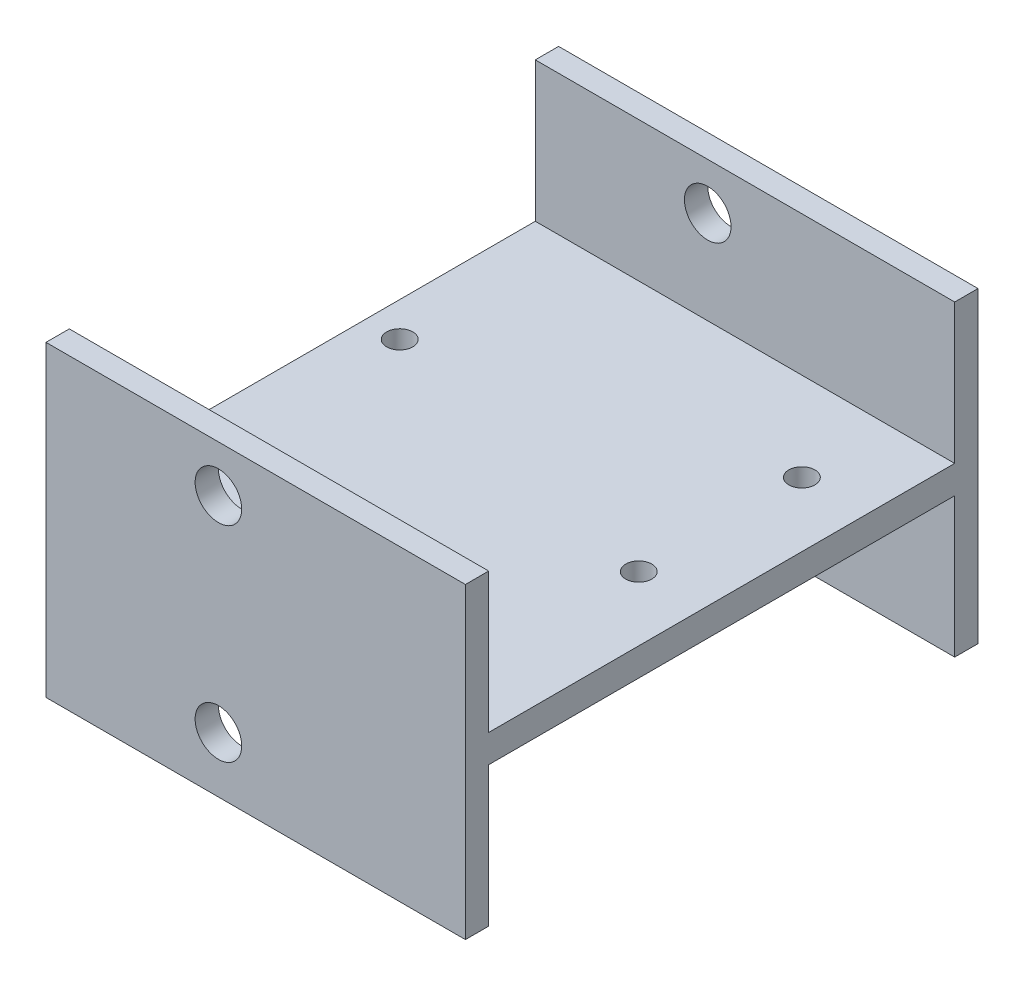
ISO-10303-21;
HEADER;
FILE_DESCRIPTION(('STEP AP214'),'2;1');
FILE_NAME('part.step','',(''),(''),'','','');
FILE_SCHEMA(('AUTOMOTIVE_DESIGN { 1 0 10303 214 1 1 1 1 }'));
ENDSEC;
DATA;
#1=APPLICATION_CONTEXT('core data for automotive mechanical design processes');
#2=APPLICATION_PROTOCOL_DEFINITION('international standard','automotive_design',2000,#1);
#3=PRODUCT_CONTEXT('',#1,'mechanical');
#4=PRODUCT('Part','Part','',(#3));
#5=PRODUCT_RELATED_PRODUCT_CATEGORY('part','',(#4));
#6=PRODUCT_DEFINITION_FORMATION('','',#4);
#7=PRODUCT_DEFINITION_CONTEXT('part definition',#1,'design');
#8=PRODUCT_DEFINITION('design','',#6,#7);
#9=PRODUCT_DEFINITION_SHAPE('','',#8);
#10=(LENGTH_UNIT() NAMED_UNIT(*) SI_UNIT(.MILLI.,.METRE.));
#11=(NAMED_UNIT(*) PLANE_ANGLE_UNIT() SI_UNIT($,.RADIAN.));
#12=(NAMED_UNIT(*) SI_UNIT($,.STERADIAN.) SOLID_ANGLE_UNIT());
#13=UNCERTAINTY_MEASURE_WITH_UNIT(LENGTH_MEASURE(1.E-05),#10,'distance_accuracy_value','');
#14=(GEOMETRIC_REPRESENTATION_CONTEXT(3) GLOBAL_UNCERTAINTY_ASSIGNED_CONTEXT((#13)) GLOBAL_UNIT_ASSIGNED_CONTEXT((#10,
#11,#12)) REPRESENTATION_CONTEXT('',''));
#15=CARTESIAN_POINT('',(0.,0.,0.));
#16=DIRECTION('',(0.,0.,1.));
#17=DIRECTION('',(1.,0.,0.));
#18=AXIS2_PLACEMENT_3D('',#15,#16,#17);
#19=CARTESIAN_POINT('',(-3.07377049180328,3.72540983606557,55.));
#20=DIRECTION('',(0.,-1.,0.));
#21=DIRECTION('',(0.,0.,-1.));
#22=AXIS2_PLACEMENT_3D('',#19,#20,#21);
#23=PLANE('',#22);
#24=CARTESIAN_POINT('',(0.626229508196735,3.72540983606558,20.75));
#25=DIRECTION('',(0.,-1.,0.));
#26=DIRECTION('',(0.,0.,-1.));
#27=AXIS2_PLACEMENT_3D('',#24,#25,#26);
#28=CIRCLE('',#27,1.4);
#29=CARTESIAN_POINT('',(0.626229508196735,3.72540983606558,19.35));
#30=VERTEX_POINT('',#29);
#31=EDGE_CURVE('E239',#30,#30,#28,.T.);
#32=ORIENTED_EDGE('',*,*,#31,.T.);
#33=EDGE_LOOP('',(#32));
#34=FACE_BOUND('',#33,.T.);
#35=CARTESIAN_POINT('',(35.0262295081967,3.72540983606558,12.));
#36=DIRECTION('',(0.,-1.,0.));
#37=DIRECTION('',(0.,0.,-1.));
#38=AXIS2_PLACEMENT_3D('',#35,#36,#37);
#39=CIRCLE('',#38,1.4);
#40=CARTESIAN_POINT('',(35.0262295081967,3.72540983606558,10.6));
#41=VERTEX_POINT('',#40);
#42=EDGE_CURVE('E247',#41,#41,#39,.T.);
#43=ORIENTED_EDGE('',*,*,#42,.T.);
#44=EDGE_LOOP('',(#43));
#45=FACE_BOUND('',#44,.T.);
#46=CARTESIAN_POINT('',(35.0262295081967,3.72540983606558,29.5));
#47=DIRECTION('',(0.,-1.,0.));
#48=DIRECTION('',(0.,0.,-1.));
#49=AXIS2_PLACEMENT_3D('',#46,#47,#48);
#50=CIRCLE('',#49,1.4);
#51=CARTESIAN_POINT('',(35.0262295081967,3.72540983606558,28.1));
#52=VERTEX_POINT('',#51);
#53=EDGE_CURVE('E229',#52,#52,#50,.T.);
#54=ORIENTED_EDGE('',*,*,#53,.T.);
#55=EDGE_LOOP('',(#54));
#56=FACE_BOUND('',#55,.T.);
#57=DIRECTION('',(1.,0.,0.));
#58=VECTOR('',#57,1.);
#59=CARTESIAN_POINT('',(41.9262295081967,3.72540983606557,2.5));
#60=LINE('',#59,#58);
#61=CARTESIAN_POINT('',(-3.07377049180328,3.72540983606557,2.5));
#62=VERTEX_POINT('',#61);
#63=CARTESIAN_POINT('',(41.9262295081967,3.72540983606557,2.5));
#64=VERTEX_POINT('',#63);
#65=EDGE_CURVE('E49',#62,#64,#60,.T.);
#66=ORIENTED_EDGE('',*,*,#65,.F.);
#67=DIRECTION('',(0.,0.,-1.));
#68=VECTOR('',#67,1.);
#69=CARTESIAN_POINT('',(-3.07377049180328,3.72540983606557,55.));
#70=LINE('',#69,#68);
#71=CARTESIAN_POINT('',(-3.07377049180328,3.72540983606557,52.5));
#72=VERTEX_POINT('',#71);
#73=EDGE_CURVE('E238',#72,#62,#70,.T.);
#74=ORIENTED_EDGE('',*,*,#73,.F.);
#75=DIRECTION('',(-1.,0.,0.));
#76=VECTOR('',#75,1.);
#77=CARTESIAN_POINT('',(41.9262295081967,3.72540983606557,52.5));
#78=LINE('',#77,#76);
#79=CARTESIAN_POINT('',(41.9262295081967,3.72540983606557,52.5));
#80=VERTEX_POINT('',#79);
#81=EDGE_CURVE('E158',#80,#72,#78,.T.);
#82=ORIENTED_EDGE('',*,*,#81,.F.);
#83=DIRECTION('',(0.,0.,-1.));
#84=VECTOR('',#83,1.);
#85=CARTESIAN_POINT('',(41.9262295081967,3.72540983606557,55.));
#86=LINE('',#85,#84);
#87=EDGE_CURVE('E54',#80,#64,#86,.T.);
#88=ORIENTED_EDGE('',*,*,#87,.T.);
#89=EDGE_LOOP('',(#66,#74,#82,#88));
#90=FACE_BOUND('',#89,.T.);
#91=ADVANCED_FACE('F32',(#34,#45,#56,#90),#23,.F.);
#92=CARTESIAN_POINT('',(-3.07377049180328,0.725409836065575,55.));
#93=DIRECTION('',(0.,1.,0.));
#94=DIRECTION('',(-1.,0.,0.));
#95=AXIS2_PLACEMENT_3D('',#92,#93,#94);
#96=PLANE('',#95);
#97=CARTESIAN_POINT('',(0.626229508196735,0.725409836065575,20.75));
#98=DIRECTION('',(0.,-1.,0.));
#99=DIRECTION('',(1.,0.,0.));
#100=AXIS2_PLACEMENT_3D('',#97,#98,#99);
#101=CIRCLE('',#100,1.4);
#102=CARTESIAN_POINT('',(2.02622950819673,0.725409836065575,20.75));
#103=VERTEX_POINT('',#102);
#104=EDGE_CURVE('E226',#103,#103,#101,.T.);
#105=ORIENTED_EDGE('',*,*,#104,.F.);
#106=EDGE_LOOP('',(#105));
#107=FACE_BOUND('',#106,.T.);
#108=CARTESIAN_POINT('',(35.0262295081967,0.725409836065575,12.));
#109=DIRECTION('',(0.,-1.,0.));
#110=DIRECTION('',(1.,0.,0.));
#111=AXIS2_PLACEMENT_3D('',#108,#109,#110);
#112=CIRCLE('',#111,1.4);
#113=CARTESIAN_POINT('',(36.4262295081967,0.725409836065575,12.));
#114=VERTEX_POINT('',#113);
#115=EDGE_CURVE('E230',#114,#114,#112,.T.);
#116=ORIENTED_EDGE('',*,*,#115,.F.);
#117=EDGE_LOOP('',(#116));
#118=FACE_BOUND('',#117,.T.);
#119=CARTESIAN_POINT('',(35.0262295081967,0.725409836065575,29.5));
#120=DIRECTION('',(0.,-1.,0.));
#121=DIRECTION('',(1.,0.,0.));
#122=AXIS2_PLACEMENT_3D('',#119,#120,#121);
#123=CIRCLE('',#122,1.4);
#124=CARTESIAN_POINT('',(36.4262295081967,0.725409836065575,29.5));
#125=VERTEX_POINT('',#124);
#126=EDGE_CURVE('E225',#125,#125,#123,.T.);
#127=ORIENTED_EDGE('',*,*,#126,.F.);
#128=EDGE_LOOP('',(#127));
#129=FACE_BOUND('',#128,.T.);
#130=DIRECTION('',(-1.,0.,0.));
#131=VECTOR('',#130,1.);
#132=CARTESIAN_POINT('',(-3.07377049180328,0.725409836065575,2.5));
#133=LINE('',#132,#131);
#134=CARTESIAN_POINT('',(41.9262295081967,0.725409836065575,2.5));
#135=VERTEX_POINT('',#134);
#136=CARTESIAN_POINT('',(-3.07377049180328,0.725409836065575,2.5));
#137=VERTEX_POINT('',#136);
#138=EDGE_CURVE('E188',#135,#137,#133,.T.);
#139=ORIENTED_EDGE('',*,*,#138,.F.);
#140=DIRECTION('',(0.,0.,-1.));
#141=VECTOR('',#140,1.);
#142=CARTESIAN_POINT('',(41.9262295081967,0.725409836065575,55.));
#143=LINE('',#142,#141);
#144=CARTESIAN_POINT('',(41.9262295081967,0.725409836065575,52.5));
#145=VERTEX_POINT('',#144);
#146=EDGE_CURVE('E41',#145,#135,#143,.T.);
#147=ORIENTED_EDGE('',*,*,#146,.F.);
#148=DIRECTION('',(1.,0.,0.));
#149=VECTOR('',#148,1.);
#150=CARTESIAN_POINT('',(-3.07377049180328,0.725409836065575,52.5));
#151=LINE('',#150,#149);
#152=CARTESIAN_POINT('',(-3.07377049180328,0.725409836065575,52.5));
#153=VERTEX_POINT('',#152);
#154=EDGE_CURVE('E205',#153,#145,#151,.T.);
#155=ORIENTED_EDGE('',*,*,#154,.F.);
#156=DIRECTION('',(0.,0.,-1.));
#157=VECTOR('',#156,1.);
#158=CARTESIAN_POINT('',(-3.07377049180328,0.725409836065575,55.));
#159=LINE('',#158,#157);
#160=EDGE_CURVE('E11',#153,#137,#159,.T.);
#161=ORIENTED_EDGE('',*,*,#160,.T.);
#162=EDGE_LOOP('',(#139,#147,#155,#161));
#163=FACE_BOUND('',#162,.T.);
#164=ADVANCED_FACE('F282',(#107,#118,#129,#163),#96,.F.);
#165=CARTESIAN_POINT('',(-3.07377049180328,3.72540983606557,55.));
#166=DIRECTION('',(1.,0.,0.));
#167=DIRECTION('',(0.,0.,-1.));
#168=AXIS2_PLACEMENT_3D('',#165,#166,#167);
#169=PLANE('',#168);
#170=DIRECTION('',(0.,-1.,0.));
#171=VECTOR('',#170,1.);
#172=CARTESIAN_POINT('',(-3.07377049180328,3.72540983606557,0.));
#173=LINE('',#172,#171);
#174=CARTESIAN_POINT('',(-3.07377049180328,18.7254098360656,0.));
#175=VERTEX_POINT('',#174);
#176=CARTESIAN_POINT('',(-3.07377049180328,-14.2745901639344,0.));
#177=VERTEX_POINT('',#176);
#178=EDGE_CURVE('E132',#175,#177,#173,.T.);
#179=ORIENTED_EDGE('',*,*,#178,.T.);
#180=DIRECTION('',(0.,0.,-1.));
#181=VECTOR('',#180,1.);
#182=CARTESIAN_POINT('',(-3.07377049180328,-14.2745901639344,0.));
#183=LINE('',#182,#181);
#184=CARTESIAN_POINT('',(-3.07377049180328,-14.2745901639344,2.5));
#185=VERTEX_POINT('',#184);
#186=EDGE_CURVE('E189',#185,#177,#183,.T.);
#187=ORIENTED_EDGE('',*,*,#186,.F.);
#188=DIRECTION('',(0.,1.,0.));
#189=VECTOR('',#188,1.);
#190=CARTESIAN_POINT('',(-3.07377049180328,-14.2745901639344,2.5));
#191=LINE('',#190,#189);
#192=EDGE_CURVE('E197',#185,#137,#191,.T.);
#193=ORIENTED_EDGE('',*,*,#192,.T.);
#194=ORIENTED_EDGE('',*,*,#160,.F.);
#195=DIRECTION('',(0.,1.,0.));
#196=VECTOR('',#195,1.);
#197=CARTESIAN_POINT('',(-3.07377049180328,-14.2745901639344,52.5));
#198=LINE('',#197,#196);
#199=CARTESIAN_POINT('',(-3.07377049180328,-14.2745901639344,52.5));
#200=VERTEX_POINT('',#199);
#201=EDGE_CURVE('E222',#200,#153,#198,.T.);
#202=ORIENTED_EDGE('',*,*,#201,.F.);
#203=DIRECTION('',(0.,0.,-1.));
#204=VECTOR('',#203,1.);
#205=CARTESIAN_POINT('',(-3.07377049180328,-14.2745901639344,55.));
#206=LINE('',#205,#204);
#207=CARTESIAN_POINT('',(-3.07377049180328,-14.2745901639344,55.));
#208=VERTEX_POINT('',#207);
#209=EDGE_CURVE('E206',#208,#200,#206,.T.);
#210=ORIENTED_EDGE('',*,*,#209,.F.);
#211=DIRECTION('',(0.,-1.,0.));
#212=VECTOR('',#211,1.);
#213=CARTESIAN_POINT('',(-3.07377049180328,3.72540983606557,55.));
#214=LINE('',#213,#212);
#215=CARTESIAN_POINT('',(-3.07377049180328,18.7254098360656,55.));
#216=VERTEX_POINT('',#215);
#217=EDGE_CURVE('E131',#216,#208,#214,.T.);
#218=ORIENTED_EDGE('',*,*,#217,.F.);
#219=DIRECTION('',(0.,0.,1.));
#220=VECTOR('',#219,1.);
#221=CARTESIAN_POINT('',(-3.07377049180328,18.7254098360656,55.));
#222=LINE('',#221,#220);
#223=CARTESIAN_POINT('',(-3.07377049180328,18.7254098360656,52.5));
#224=VERTEX_POINT('',#223);
#225=EDGE_CURVE('E164',#224,#216,#222,.T.);
#226=ORIENTED_EDGE('',*,*,#225,.F.);
#227=DIRECTION('',(0.,-1.,0.));
#228=VECTOR('',#227,1.);
#229=CARTESIAN_POINT('',(-3.07377049180328,18.7254098360656,52.5));
#230=LINE('',#229,#228);
#231=EDGE_CURVE('E170',#224,#72,#230,.T.);
#232=ORIENTED_EDGE('',*,*,#231,.T.);
#233=ORIENTED_EDGE('',*,*,#73,.T.);
#234=DIRECTION('',(0.,-1.,0.));
#235=VECTOR('',#234,1.);
#236=CARTESIAN_POINT('',(-3.07377049180328,18.7254098360656,2.50000000000001));
#237=LINE('',#236,#235);
#238=CARTESIAN_POINT('',(-3.07377049180328,18.7254098360656,2.50000000000001));
#239=VERTEX_POINT('',#238);
#240=EDGE_CURVE('E155',#239,#62,#237,.T.);
#241=ORIENTED_EDGE('',*,*,#240,.F.);
#242=DIRECTION('',(0.,0.,1.));
#243=VECTOR('',#242,1.);
#244=CARTESIAN_POINT('',(-3.07377049180328,18.7254098360656,0.));
#245=LINE('',#244,#243);
#246=EDGE_CURVE('E139',#175,#239,#245,.T.);
#247=ORIENTED_EDGE('',*,*,#246,.F.);
#248=EDGE_LOOP('',(#179,#187,#193,#194,#202,#210,#218,#226,#232,#233,#241,#247));
#249=FACE_BOUND('',#248,.T.);
#250=ADVANCED_FACE('F34',(#249),#169,.F.);
#251=CARTESIAN_POINT('',(41.9262295081967,3.72540983606557,55.));
#252=DIRECTION('',(-1.,0.,0.));
#253=DIRECTION('',(0.,0.,1.));
#254=AXIS2_PLACEMENT_3D('',#251,#252,#253);
#255=PLANE('',#254);
#256=DIRECTION('',(0.,1.,0.));
#257=VECTOR('',#256,1.);
#258=CARTESIAN_POINT('',(41.9262295081967,3.72540983606557,0.));
#259=LINE('',#258,#257);
#260=CARTESIAN_POINT('',(41.9262295081967,-14.2745901639344,0.));
#261=VERTEX_POINT('',#260);
#262=CARTESIAN_POINT('',(41.9262295081967,18.7254098360656,0.));
#263=VERTEX_POINT('',#262);
#264=EDGE_CURVE('E120',#261,#263,#259,.T.);
#265=ORIENTED_EDGE('',*,*,#264,.T.);
#266=DIRECTION('',(0.,0.,-1.));
#267=VECTOR('',#266,1.);
#268=CARTESIAN_POINT('',(41.9262295081967,18.7254098360656,0.));
#269=LINE('',#268,#267);
#270=CARTESIAN_POINT('',(41.9262295081967,18.7254098360656,2.5));
#271=VERTEX_POINT('',#270);
#272=EDGE_CURVE('E125',#271,#263,#269,.T.);
#273=ORIENTED_EDGE('',*,*,#272,.F.);
#274=DIRECTION('',(0.,-1.,0.));
#275=VECTOR('',#274,1.);
#276=CARTESIAN_POINT('',(41.9262295081967,18.7254098360656,2.5));
#277=LINE('',#276,#275);
#278=EDGE_CURVE('E152',#271,#64,#277,.T.);
#279=ORIENTED_EDGE('',*,*,#278,.T.);
#280=ORIENTED_EDGE('',*,*,#87,.F.);
#281=DIRECTION('',(0.,-1.,0.));
#282=VECTOR('',#281,1.);
#283=CARTESIAN_POINT('',(41.9262295081967,18.7254098360656,52.5));
#284=LINE('',#283,#282);
#285=CARTESIAN_POINT('',(41.9262295081967,18.7254098360656,52.5));
#286=VERTEX_POINT('',#285);
#287=EDGE_CURVE('E175',#286,#80,#284,.T.);
#288=ORIENTED_EDGE('',*,*,#287,.F.);
#289=DIRECTION('',(0.,0.,-1.));
#290=VECTOR('',#289,1.);
#291=CARTESIAN_POINT('',(41.9262295081967,18.7254098360656,55.));
#292=LINE('',#291,#290);
#293=CARTESIAN_POINT('',(41.9262295081967,18.7254098360656,55.));
#294=VERTEX_POINT('',#293);
#295=EDGE_CURVE('E159',#294,#286,#292,.T.);
#296=ORIENTED_EDGE('',*,*,#295,.F.);
#297=DIRECTION('',(0.,1.,0.));
#298=VECTOR('',#297,1.);
#299=CARTESIAN_POINT('',(41.9262295081967,3.72540983606557,55.));
#300=LINE('',#299,#298);
#301=CARTESIAN_POINT('',(41.9262295081967,-14.2745901639344,55.));
#302=VERTEX_POINT('',#301);
#303=EDGE_CURVE('E236',#302,#294,#300,.T.);
#304=ORIENTED_EDGE('',*,*,#303,.F.);
#305=DIRECTION('',(0.,0.,1.));
#306=VECTOR('',#305,1.);
#307=CARTESIAN_POINT('',(41.9262295081967,-14.2745901639344,55.));
#308=LINE('',#307,#306);
#309=CARTESIAN_POINT('',(41.9262295081967,-14.2745901639344,52.5));
#310=VERTEX_POINT('',#309);
#311=EDGE_CURVE('E211',#310,#302,#308,.T.);
#312=ORIENTED_EDGE('',*,*,#311,.F.);
#313=DIRECTION('',(0.,1.,0.));
#314=VECTOR('',#313,1.);
#315=CARTESIAN_POINT('',(41.9262295081967,-14.2745901639344,52.5));
#316=LINE('',#315,#314);
#317=EDGE_CURVE('E217',#310,#145,#316,.T.);
#318=ORIENTED_EDGE('',*,*,#317,.T.);
#319=ORIENTED_EDGE('',*,*,#146,.T.);
#320=DIRECTION('',(0.,1.,0.));
#321=VECTOR('',#320,1.);
#322=CARTESIAN_POINT('',(41.9262295081967,-14.2745901639344,2.5));
#323=LINE('',#322,#321);
#324=CARTESIAN_POINT('',(41.9262295081967,-14.2745901639344,2.5));
#325=VERTEX_POINT('',#324);
#326=EDGE_CURVE('E202',#325,#135,#323,.T.);
#327=ORIENTED_EDGE('',*,*,#326,.F.);
#328=DIRECTION('',(0.,0.,1.));
#329=VECTOR('',#328,1.);
#330=CARTESIAN_POINT('',(41.9262295081967,-14.2745901639344,0.));
#331=LINE('',#330,#329);
#332=EDGE_CURVE('E127',#261,#325,#331,.T.);
#333=ORIENTED_EDGE('',*,*,#332,.F.);
#334=EDGE_LOOP('',(#265,#273,#279,#280,#288,#296,#304,#312,#318,#319,#327,#333));
#335=FACE_BOUND('',#334,.T.);
#336=ADVANCED_FACE('F122',(#335),#255,.F.);
#337=CARTESIAN_POINT('',(0.,0.,55.));
#338=DIRECTION('',(0.,0.,1.));
#339=DIRECTION('',(1.,0.,0.));
#340=AXIS2_PLACEMENT_3D('',#337,#338,#339);
#341=PLANE('',#340);
#342=CARTESIAN_POINT('',(15.4262295081967,13.7254098360656,55.));
#343=DIRECTION('',(0.,0.,1.));
#344=DIRECTION('',(1.,0.,0.));
#345=AXIS2_PLACEMENT_3D('',#342,#343,#344);
#346=CIRCLE('',#345,2.5);
#347=CARTESIAN_POINT('',(17.9262295081967,13.7254098360656,55.));
#348=VERTEX_POINT('',#347);
#349=EDGE_CURVE('E524',#348,#348,#346,.T.);
#350=ORIENTED_EDGE('',*,*,#349,.F.);
#351=EDGE_LOOP('',(#350));
#352=FACE_BOUND('',#351,.T.);
#353=CARTESIAN_POINT('',(15.4262295081967,-8.27459016393443,55.));
#354=DIRECTION('',(0.,0.,1.));
#355=DIRECTION('',(1.,0.,0.));
#356=AXIS2_PLACEMENT_3D('',#353,#354,#355);
#357=CIRCLE('',#356,2.5);
#358=CARTESIAN_POINT('',(17.9262295081967,-8.27459016393443,55.));
#359=VERTEX_POINT('',#358);
#360=EDGE_CURVE('E178',#359,#359,#357,.T.);
#361=ORIENTED_EDGE('',*,*,#360,.F.);
#362=EDGE_LOOP('',(#361));
#363=FACE_BOUND('',#362,.T.);
#364=ORIENTED_EDGE('',*,*,#217,.T.);
#365=DIRECTION('',(-1.,0.,0.));
#366=VECTOR('',#365,1.);
#367=CARTESIAN_POINT('',(-3.07377049180328,-14.2745901639344,55.));
#368=LINE('',#367,#366);
#369=EDGE_CURVE('E214',#302,#208,#368,.T.);
#370=ORIENTED_EDGE('',*,*,#369,.F.);
#371=ORIENTED_EDGE('',*,*,#303,.T.);
#372=DIRECTION('',(1.,0.,0.));
#373=VECTOR('',#372,1.);
#374=CARTESIAN_POINT('',(41.9262295081967,18.7254098360656,55.));
#375=LINE('',#374,#373);
#376=EDGE_CURVE('E167',#216,#294,#375,.T.);
#377=ORIENTED_EDGE('',*,*,#376,.F.);
#378=EDGE_LOOP('',(#364,#370,#371,#377));
#379=FACE_BOUND('',#378,.T.);
#380=ADVANCED_FACE('F267',(#352,#363,#379),#341,.T.);
#381=CARTESIAN_POINT('',(0.,0.,0.));
#382=DIRECTION('',(0.,0.,1.));
#383=DIRECTION('',(1.,0.,0.));
#384=AXIS2_PLACEMENT_3D('',#381,#382,#383);
#385=PLANE('',#384);
#386=CARTESIAN_POINT('',(15.4262295081967,13.7254098360656,0.));
#387=DIRECTION('',(0.,0.,1.));
#388=DIRECTION('',(1.,0.,0.));
#389=AXIS2_PLACEMENT_3D('',#386,#387,#388);
#390=CIRCLE('',#389,2.5);
#391=CARTESIAN_POINT('',(17.9262295081967,13.7254098360656,0.));
#392=VERTEX_POINT('',#391);
#393=EDGE_CURVE('E146',#392,#392,#390,.T.);
#394=ORIENTED_EDGE('',*,*,#393,.T.);
#395=EDGE_LOOP('',(#394));
#396=FACE_BOUND('',#395,.T.);
#397=CARTESIAN_POINT('',(15.4262295081967,-8.27459016393443,0.));
#398=DIRECTION('',(0.,0.,1.));
#399=DIRECTION('',(1.,0.,0.));
#400=AXIS2_PLACEMENT_3D('',#397,#398,#399);
#401=CIRCLE('',#400,2.5);
#402=CARTESIAN_POINT('',(17.9262295081967,-8.27459016393443,0.));
#403=VERTEX_POINT('',#402);
#404=EDGE_CURVE('E185',#403,#403,#401,.T.);
#405=ORIENTED_EDGE('',*,*,#404,.T.);
#406=EDGE_LOOP('',(#405));
#407=FACE_BOUND('',#406,.T.);
#408=ORIENTED_EDGE('',*,*,#178,.F.);
#409=DIRECTION('',(-1.,0.,0.));
#410=VECTOR('',#409,1.);
#411=CARTESIAN_POINT('',(41.9262295081967,18.7254098360656,0.));
#412=LINE('',#411,#410);
#413=EDGE_CURVE('E135',#263,#175,#412,.T.);
#414=ORIENTED_EDGE('',*,*,#413,.F.);
#415=ORIENTED_EDGE('',*,*,#264,.F.);
#416=DIRECTION('',(1.,0.,0.));
#417=VECTOR('',#416,1.);
#418=CARTESIAN_POINT('',(-3.07377049180328,-14.2745901639344,0.));
#419=LINE('',#418,#417);
#420=EDGE_CURVE('E192',#177,#261,#419,.T.);
#421=ORIENTED_EDGE('',*,*,#420,.F.);
#422=EDGE_LOOP('',(#408,#414,#415,#421));
#423=FACE_BOUND('',#422,.T.);
#424=ADVANCED_FACE('F136',(#396,#407,#423),#385,.F.);
#425=CARTESIAN_POINT('',(35.0262295081967,50.7254098360656,29.5));
#426=DIRECTION('',(0.,-1.,0.));
#427=DIRECTION('',(1.,0.,0.));
#428=AXIS2_PLACEMENT_3D('',#425,#426,#427);
#429=CYLINDRICAL_SURFACE('',#428,1.4);
#430=ORIENTED_EDGE('',*,*,#126,.T.);
#431=EDGE_LOOP('',(#430));
#432=FACE_BOUND('',#431,.T.);
#433=ORIENTED_EDGE('',*,*,#53,.F.);
#434=EDGE_LOOP('',(#433));
#435=FACE_BOUND('',#434,.T.);
#436=ADVANCED_FACE('F266',(#432,#435),#429,.F.);
#437=CARTESIAN_POINT('',(35.0262295081967,50.7254098360656,12.));
#438=DIRECTION('',(0.,-1.,0.));
#439=DIRECTION('',(1.,0.,0.));
#440=AXIS2_PLACEMENT_3D('',#437,#438,#439);
#441=CYLINDRICAL_SURFACE('',#440,1.4);
#442=ORIENTED_EDGE('',*,*,#115,.T.);
#443=EDGE_LOOP('',(#442));
#444=FACE_BOUND('',#443,.T.);
#445=ORIENTED_EDGE('',*,*,#42,.F.);
#446=EDGE_LOOP('',(#445));
#447=FACE_BOUND('',#446,.T.);
#448=ADVANCED_FACE('F274',(#444,#447),#441,.F.);
#449=CARTESIAN_POINT('',(0.626229508196735,50.7254098360656,20.75));
#450=DIRECTION('',(0.,-1.,0.));
#451=DIRECTION('',(1.,0.,0.));
#452=AXIS2_PLACEMENT_3D('',#449,#450,#451);
#453=CYLINDRICAL_SURFACE('',#452,1.4);
#454=ORIENTED_EDGE('',*,*,#104,.T.);
#455=EDGE_LOOP('',(#454));
#456=FACE_BOUND('',#455,.T.);
#457=ORIENTED_EDGE('',*,*,#31,.F.);
#458=EDGE_LOOP('',(#457));
#459=FACE_BOUND('',#458,.T.);
#460=ADVANCED_FACE('F349',(#456,#459),#453,.F.);
#461=CARTESIAN_POINT('',(-3.07377049180328,-14.2745901639344,52.5));
#462=DIRECTION('',(0.,0.,1.));
#463=DIRECTION('',(1.,0.,0.));
#464=AXIS2_PLACEMENT_3D('',#461,#462,#463);
#465=PLANE('',#464);
#466=CARTESIAN_POINT('',(15.4262295081967,-8.27459016393443,52.5));
#467=DIRECTION('',(0.,0.,1.));
#468=DIRECTION('',(1.,0.,0.));
#469=AXIS2_PLACEMENT_3D('',#466,#467,#468);
#470=CIRCLE('',#469,2.5);
#471=CARTESIAN_POINT('',(17.9262295081967,-8.27459016393443,52.5));
#472=VERTEX_POINT('',#471);
#473=EDGE_CURVE('E182',#472,#472,#470,.T.);
#474=ORIENTED_EDGE('',*,*,#473,.T.);
#475=EDGE_LOOP('',(#474));
#476=FACE_BOUND('',#475,.T.);
#477=ORIENTED_EDGE('',*,*,#154,.T.);
#478=ORIENTED_EDGE('',*,*,#317,.F.);
#479=DIRECTION('',(1.,0.,0.));
#480=VECTOR('',#479,1.);
#481=CARTESIAN_POINT('',(-3.07377049180328,-14.2745901639344,52.5));
#482=LINE('',#481,#480);
#483=EDGE_CURVE('E209',#200,#310,#482,.T.);
#484=ORIENTED_EDGE('',*,*,#483,.F.);
#485=ORIENTED_EDGE('',*,*,#201,.T.);
#486=EDGE_LOOP('',(#477,#478,#484,#485));
#487=FACE_BOUND('',#486,.T.);
#488=ADVANCED_FACE('F307',(#476,#487),#465,.F.);
#489=CARTESIAN_POINT('',(0.,-14.2745901639344,0.));
#490=DIRECTION('',(0.,-1.,0.));
#491=DIRECTION('',(1.,0.,0.));
#492=AXIS2_PLACEMENT_3D('',#489,#490,#491);
#493=PLANE('',#492);
#494=ORIENTED_EDGE('',*,*,#209,.T.);
#495=ORIENTED_EDGE('',*,*,#483,.T.);
#496=ORIENTED_EDGE('',*,*,#311,.T.);
#497=ORIENTED_EDGE('',*,*,#369,.T.);
#498=EDGE_LOOP('',(#494,#495,#496,#497));
#499=FACE_BOUND('',#498,.T.);
#500=ADVANCED_FACE('F311',(#499),#493,.T.);
#501=CARTESIAN_POINT('',(-3.07377049180328,-14.2745901639344,2.5));
#502=DIRECTION('',(0.,0.,-1.));
#503=DIRECTION('',(-1.,0.,0.));
#504=AXIS2_PLACEMENT_3D('',#501,#502,#503);
#505=PLANE('',#504);
#506=CARTESIAN_POINT('',(15.4262295081967,-8.27459016393443,2.5));
#507=DIRECTION('',(0.,0.,-1.));
#508=DIRECTION('',(-1.,0.,0.));
#509=AXIS2_PLACEMENT_3D('',#506,#507,#508);
#510=CIRCLE('',#509,2.5);
#511=CARTESIAN_POINT('',(12.9262295081967,-8.27459016393443,2.5));
#512=VERTEX_POINT('',#511);
#513=EDGE_CURVE('E181',#512,#512,#510,.T.);
#514=ORIENTED_EDGE('',*,*,#513,.T.);
#515=EDGE_LOOP('',(#514));
#516=FACE_BOUND('',#515,.T.);
#517=ORIENTED_EDGE('',*,*,#138,.T.);
#518=ORIENTED_EDGE('',*,*,#192,.F.);
#519=DIRECTION('',(-1.,0.,0.));
#520=VECTOR('',#519,1.);
#521=CARTESIAN_POINT('',(-3.07377049180328,-14.2745901639344,2.5));
#522=LINE('',#521,#520);
#523=EDGE_CURVE('E195',#325,#185,#522,.T.);
#524=ORIENTED_EDGE('',*,*,#523,.F.);
#525=ORIENTED_EDGE('',*,*,#326,.T.);
#526=EDGE_LOOP('',(#517,#518,#524,#525));
#527=FACE_BOUND('',#526,.T.);
#528=ADVANCED_FACE('F254',(#516,#527),#505,.F.);
#529=CARTESIAN_POINT('',(0.,-14.2745901639344,0.));
#530=DIRECTION('',(0.,1.,0.));
#531=DIRECTION('',(-1.,0.,0.));
#532=AXIS2_PLACEMENT_3D('',#529,#530,#531);
#533=PLANE('',#532);
#534=ORIENTED_EDGE('',*,*,#186,.T.);
#535=ORIENTED_EDGE('',*,*,#420,.T.);
#536=ORIENTED_EDGE('',*,*,#332,.T.);
#537=ORIENTED_EDGE('',*,*,#523,.T.);
#538=EDGE_LOOP('',(#534,#535,#536,#537));
#539=FACE_BOUND('',#538,.T.);
#540=ADVANCED_FACE('F261',(#539),#533,.F.);
#541=CARTESIAN_POINT('',(15.4262295081967,-8.27459016393443,-10.));
#542=DIRECTION('',(0.,0.,1.));
#543=DIRECTION('',(1.,0.,0.));
#544=AXIS2_PLACEMENT_3D('',#541,#542,#543);
#545=CYLINDRICAL_SURFACE('',#544,2.5);
#546=ORIENTED_EDGE('',*,*,#513,.F.);
#547=EDGE_LOOP('',(#546));
#548=FACE_BOUND('',#547,.T.);
#549=ORIENTED_EDGE('',*,*,#404,.F.);
#550=EDGE_LOOP('',(#549));
#551=FACE_BOUND('',#550,.T.);
#552=ADVANCED_FACE('F257',(#548,#551),#545,.F.);
#553=ORIENTED_EDGE('',*,*,#360,.T.);
#554=EDGE_LOOP('',(#553));
#555=FACE_BOUND('',#554,.T.);
#556=ORIENTED_EDGE('',*,*,#473,.F.);
#557=EDGE_LOOP('',(#556));
#558=FACE_BOUND('',#557,.T.);
#559=ADVANCED_FACE('F260',(#555,#558),#545,.F.);
#560=CARTESIAN_POINT('',(41.9262295081967,18.7254098360656,52.5));
#561=DIRECTION('',(0.,0.,1.));
#562=DIRECTION('',(1.,0.,0.));
#563=AXIS2_PLACEMENT_3D('',#560,#561,#562);
#564=PLANE('',#563);
#565=CARTESIAN_POINT('',(15.4262295081967,13.7254098360656,52.5));
#566=DIRECTION('',(0.,0.,1.));
#567=DIRECTION('',(1.,0.,0.));
#568=AXIS2_PLACEMENT_3D('',#565,#566,#567);
#569=CIRCLE('',#568,2.5);
#570=CARTESIAN_POINT('',(17.9262295081967,13.7254098360656,52.5));
#571=VERTEX_POINT('',#570);
#572=EDGE_CURVE('E527',#571,#571,#569,.T.);
#573=ORIENTED_EDGE('',*,*,#572,.T.);
#574=EDGE_LOOP('',(#573));
#575=FACE_BOUND('',#574,.T.);
#576=ORIENTED_EDGE('',*,*,#81,.T.);
#577=ORIENTED_EDGE('',*,*,#231,.F.);
#578=DIRECTION('',(-1.,0.,0.));
#579=VECTOR('',#578,1.);
#580=CARTESIAN_POINT('',(41.9262295081967,18.7254098360656,52.5));
#581=LINE('',#580,#579);
#582=EDGE_CURVE('E162',#286,#224,#581,.T.);
#583=ORIENTED_EDGE('',*,*,#582,.F.);
#584=ORIENTED_EDGE('',*,*,#287,.T.);
#585=EDGE_LOOP('',(#576,#577,#583,#584));
#586=FACE_BOUND('',#585,.T.);
#587=ADVANCED_FACE('F322',(#575,#586),#564,.F.);
#588=CARTESIAN_POINT('',(0.,18.7254098360656,0.));
#589=DIRECTION('',(0.,1.,0.));
#590=DIRECTION('',(0.,0.,1.));
#591=AXIS2_PLACEMENT_3D('',#588,#589,#590);
#592=PLANE('',#591);
#593=ORIENTED_EDGE('',*,*,#295,.T.);
#594=ORIENTED_EDGE('',*,*,#582,.T.);
#595=ORIENTED_EDGE('',*,*,#225,.T.);
#596=ORIENTED_EDGE('',*,*,#376,.T.);
#597=EDGE_LOOP('',(#593,#594,#595,#596));
#598=FACE_BOUND('',#597,.T.);
#599=ADVANCED_FACE('F317',(#598),#592,.T.);
#600=CARTESIAN_POINT('',(41.9262295081967,18.7254098360656,2.5));
#601=DIRECTION('',(0.,0.,-1.));
#602=DIRECTION('',(-1.,0.,0.));
#603=AXIS2_PLACEMENT_3D('',#600,#601,#602);
#604=PLANE('',#603);
#605=CARTESIAN_POINT('',(15.4262295081967,13.7254098360656,2.5));
#606=DIRECTION('',(0.,0.,-1.));
#607=DIRECTION('',(-1.,0.,0.));
#608=AXIS2_PLACEMENT_3D('',#605,#606,#607);
#609=CIRCLE('',#608,2.5);
#610=CARTESIAN_POINT('',(12.9262295081967,13.7254098360656,2.5));
#611=VERTEX_POINT('',#610);
#612=EDGE_CURVE('E36',#611,#611,#609,.T.);
#613=ORIENTED_EDGE('',*,*,#612,.T.);
#614=EDGE_LOOP('',(#613));
#615=FACE_BOUND('',#614,.T.);
#616=ORIENTED_EDGE('',*,*,#65,.T.);
#617=ORIENTED_EDGE('',*,*,#278,.F.);
#618=DIRECTION('',(1.,0.,0.));
#619=VECTOR('',#618,1.);
#620=CARTESIAN_POINT('',(41.9262295081967,18.7254098360656,2.5));
#621=LINE('',#620,#619);
#622=EDGE_CURVE('E143',#239,#271,#621,.T.);
#623=ORIENTED_EDGE('',*,*,#622,.F.);
#624=ORIENTED_EDGE('',*,*,#240,.T.);
#625=EDGE_LOOP('',(#616,#617,#623,#624));
#626=FACE_BOUND('',#625,.T.);
#627=ADVANCED_FACE('F324',(#615,#626),#604,.F.);
#628=CARTESIAN_POINT('',(0.,18.7254098360656,0.));
#629=DIRECTION('',(0.,-1.,0.));
#630=DIRECTION('',(0.,0.,-1.));
#631=AXIS2_PLACEMENT_3D('',#628,#629,#630);
#632=PLANE('',#631);
#633=ORIENTED_EDGE('',*,*,#272,.T.);
#634=ORIENTED_EDGE('',*,*,#413,.T.);
#635=ORIENTED_EDGE('',*,*,#246,.T.);
#636=ORIENTED_EDGE('',*,*,#622,.T.);
#637=EDGE_LOOP('',(#633,#634,#635,#636));
#638=FACE_BOUND('',#637,.T.);
#639=ADVANCED_FACE('F141',(#638),#632,.F.);
#640=CARTESIAN_POINT('',(15.4262295081967,13.7254098360656,-10.));
#641=DIRECTION('',(0.,0.,1.));
#642=DIRECTION('',(1.,0.,0.));
#643=AXIS2_PLACEMENT_3D('',#640,#641,#642);
#644=CYLINDRICAL_SURFACE('',#643,2.5);
#645=ORIENTED_EDGE('',*,*,#612,.F.);
#646=EDGE_LOOP('',(#645));
#647=FACE_BOUND('',#646,.T.);
#648=ORIENTED_EDGE('',*,*,#393,.F.);
#649=EDGE_LOOP('',(#648));
#650=FACE_BOUND('',#649,.T.);
#651=ADVANCED_FACE('F332',(#647,#650),#644,.F.);
#652=ORIENTED_EDGE('',*,*,#349,.T.);
#653=EDGE_LOOP('',(#652));
#654=FACE_BOUND('',#653,.T.);
#655=ORIENTED_EDGE('',*,*,#572,.F.);
#656=EDGE_LOOP('',(#655));
#657=FACE_BOUND('',#656,.T.);
#658=ADVANCED_FACE('F509',(#654,#657),#644,.F.);
#659=CLOSED_SHELL('',(#91,#164,#250,#336,#380,#424,#436,#448,#460,#488,#500,#528,#540,#552,#559,
#587,#599,#627,#639,#651,#658));
#660=MANIFOLD_SOLID_BREP('B2',#659);
#661=ADVANCED_BREP_SHAPE_REPRESENTATION('',(#18,#660),#14);
#662=SHAPE_DEFINITION_REPRESENTATION(#9,#661);
ENDSEC;
END-ISO-10303-21;
